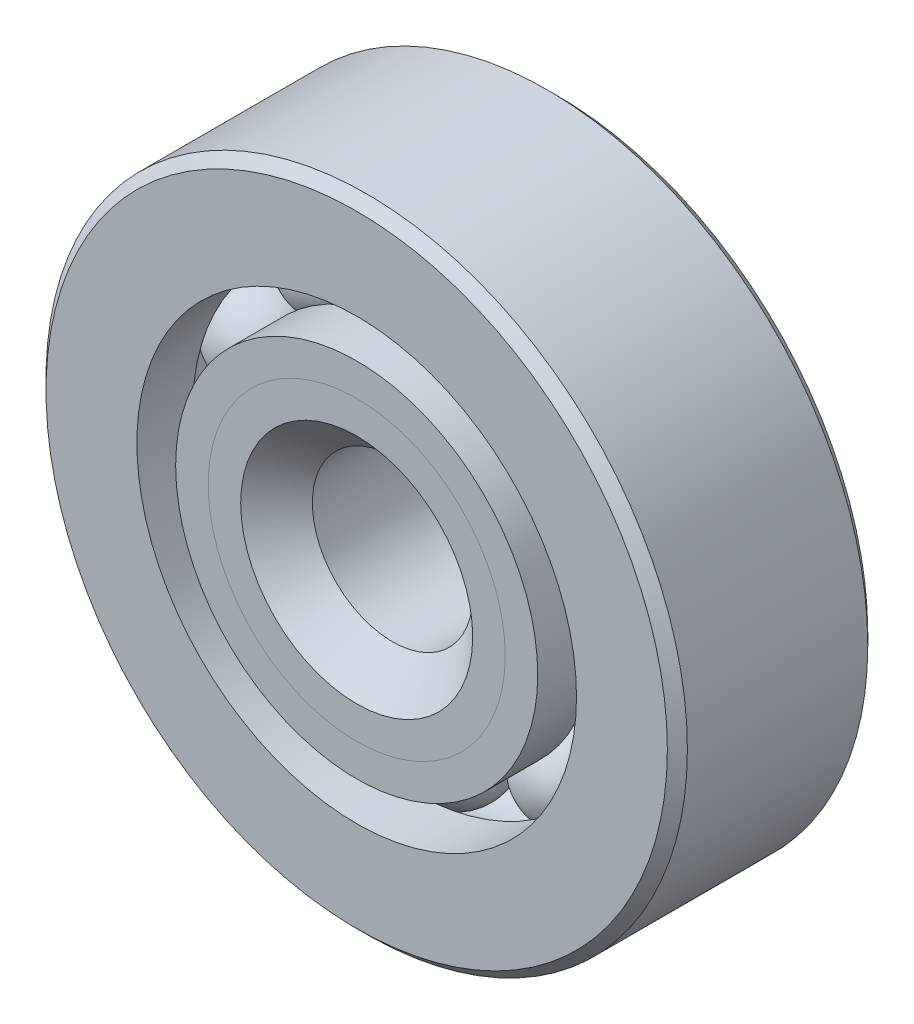
ISO-10303-21;
HEADER;
FILE_DESCRIPTION(('STEP AP214'),'2;1');
FILE_NAME('part.step','',(''),(''),'','','');
FILE_SCHEMA(('AUTOMOTIVE_DESIGN { 1 0 10303 214 1 1 1 1 }'));
ENDSEC;
DATA;
#1=APPLICATION_CONTEXT('core data for automotive mechanical design processes');
#2=APPLICATION_PROTOCOL_DEFINITION('international standard','automotive_design',2000,#1);
#3=PRODUCT_CONTEXT('',#1,'mechanical');
#4=PRODUCT('Part','Part','',(#3));
#5=PRODUCT_RELATED_PRODUCT_CATEGORY('part','',(#4));
#6=PRODUCT_DEFINITION_FORMATION('','',#4);
#7=PRODUCT_DEFINITION_CONTEXT('part definition',#1,'design');
#8=PRODUCT_DEFINITION('design','',#6,#7);
#9=PRODUCT_DEFINITION_SHAPE('','',#8);
#10=(LENGTH_UNIT() NAMED_UNIT(*) SI_UNIT(.MILLI.,.METRE.));
#11=(NAMED_UNIT(*) PLANE_ANGLE_UNIT() SI_UNIT($,.RADIAN.));
#12=(NAMED_UNIT(*) SI_UNIT($,.STERADIAN.) SOLID_ANGLE_UNIT());
#13=UNCERTAINTY_MEASURE_WITH_UNIT(LENGTH_MEASURE(1.E-05),#10,'distance_accuracy_value','');
#14=(GEOMETRIC_REPRESENTATION_CONTEXT(3) GLOBAL_UNCERTAINTY_ASSIGNED_CONTEXT((#13)) GLOBAL_UNIT_ASSIGNED_CONTEXT((#10,
#11,#12)) REPRESENTATION_CONTEXT('',''));
#15=CARTESIAN_POINT('',(0.,0.,0.));
#16=DIRECTION('',(0.,0.,1.));
#17=DIRECTION('',(1.,0.,0.));
#18=AXIS2_PLACEMENT_3D('',#15,#16,#17);
#19=CARTESIAN_POINT('',(-2.33277272003571,3.2107861964256,0.));
#20=DIRECTION('',(0.,0.,1.));
#21=DIRECTION('',(-0.587785252292462,0.809016994374955,0.));
#22=AXIS2_PLACEMENT_3D('',#19,#20,#21);
#23=SPHERICAL_SURFACE('',#22,0.961832467237323);
#24=CARTESIAN_POINT('',(-2.33277272003571,3.2107861964256,0.961832467237321));
#25=VERTEX_POINT('',#24);
#26=VERTEX_LOOP('',#25);
#27=FACE_BOUND('',#26,.T.);
#28=ADVANCED_FACE('F37',(#27),#23,.T.);
#29=CLOSED_SHELL('',(#28));
#30=MANIFOLD_SOLID_BREP('B2',#29);
#31=CARTESIAN_POINT('',(-3.77450554904638,1.22641119642562,0.));
#32=DIRECTION('',(0.,0.,1.));
#33=DIRECTION('',(-0.95105651629515,0.309016994374958,0.));
#34=AXIS2_PLACEMENT_3D('',#31,#32,#33);
#35=SPHERICAL_SURFACE('',#34,0.961832467237323);
#36=CARTESIAN_POINT('',(-3.77450554904638,1.22641119642562,0.961832467237321));
#37=VERTEX_POINT('',#36);
#38=VERTEX_LOOP('',#37);
#39=FACE_BOUND('',#38,.T.);
#40=ADVANCED_FACE('F68',(#39),#35,.T.);
#41=CLOSED_SHELL('',(#40));
#42=MANIFOLD_SOLID_BREP('B6',#41);
#43=CARTESIAN_POINT('',(-3.7745055490464,-1.22641119642554,0.));
#44=DIRECTION('',(0.,0.,1.));
#45=DIRECTION('',(-0.951056516295157,-0.309016994374938,0.));
#46=AXIS2_PLACEMENT_3D('',#43,#44,#45);
#47=SPHERICAL_SURFACE('',#46,0.961832467237323);
#48=CARTESIAN_POINT('',(-3.7745055490464,-1.22641119642554,0.961832467237321));
#49=VERTEX_POINT('',#48);
#50=VERTEX_LOOP('',#49);
#51=FACE_BOUND('',#50,.T.);
#52=ADVANCED_FACE('F99',(#51),#47,.T.);
#53=CLOSED_SHELL('',(#52));
#54=MANIFOLD_SOLID_BREP('B33',#53);
#55=CARTESIAN_POINT('',(-2.33277272003578,-3.21078619642555,0.));
#56=DIRECTION('',(0.,0.,1.));
#57=DIRECTION('',(-0.58778525229248,-0.809016994374942,0.));
#58=AXIS2_PLACEMENT_3D('',#55,#56,#57);
#59=SPHERICAL_SURFACE('',#58,0.961832467237323);
#60=CARTESIAN_POINT('',(-2.33277272003578,-3.21078619642555,0.961832467237321));
#61=VERTEX_POINT('',#60);
#62=VERTEX_LOOP('',#61);
#63=FACE_BOUND('',#62,.T.);
#64=ADVANCED_FACE('F130',(#63),#59,.T.);
#65=CLOSED_SHELL('',(#64));
#66=MANIFOLD_SOLID_BREP('B64',#65);
#67=CARTESIAN_POINT('',(0.,-3.96875,0.));
#68=DIRECTION('',(0.,0.,1.));
#69=DIRECTION('',(0.,-1.,0.));
#70=AXIS2_PLACEMENT_3D('',#67,#68,#69);
#71=SPHERICAL_SURFACE('',#70,0.961832467237323);
#72=CARTESIAN_POINT('',(0.,-3.96875,0.961832467237321));
#73=VERTEX_POINT('',#72);
#74=VERTEX_LOOP('',#73);
#75=FACE_BOUND('',#74,.T.);
#76=ADVANCED_FACE('F161',(#75),#71,.T.);
#77=CLOSED_SHELL('',(#76));
#78=MANIFOLD_SOLID_BREP('B95',#77);
#79=CARTESIAN_POINT('',(2.33277272003573,-3.21078619642559,0.));
#80=DIRECTION('',(0.,0.,1.));
#81=DIRECTION('',(0.587785252292469,-0.809016994374951,0.));
#82=AXIS2_PLACEMENT_3D('',#79,#80,#81);
#83=SPHERICAL_SURFACE('',#82,0.961832467237323);
#84=CARTESIAN_POINT('',(2.33277272003573,-3.21078619642559,0.961832467237321));
#85=VERTEX_POINT('',#84);
#86=VERTEX_LOOP('',#85);
#87=FACE_BOUND('',#86,.T.);
#88=ADVANCED_FACE('F192',(#87),#83,.T.);
#89=CLOSED_SHELL('',(#88));
#90=MANIFOLD_SOLID_BREP('B126',#89);
#91=CARTESIAN_POINT('',(3.77450554904639,-1.22641119642559,0.));
#92=DIRECTION('',(0.,0.,1.));
#93=DIRECTION('',(0.951056516295152,-0.309016994374952,0.));
#94=AXIS2_PLACEMENT_3D('',#91,#92,#93);
#95=SPHERICAL_SURFACE('',#94,0.961832467237323);
#96=CARTESIAN_POINT('',(3.77450554904639,-1.22641119642559,0.961832467237321));
#97=VERTEX_POINT('',#96);
#98=VERTEX_LOOP('',#97);
#99=FACE_BOUND('',#98,.T.);
#100=ADVANCED_FACE('F223',(#99),#95,.T.);
#101=CLOSED_SHELL('',(#100));
#102=MANIFOLD_SOLID_BREP('B157',#101);
#103=CARTESIAN_POINT('',(3.7745055490464,1.22641119642556,0.));
#104=DIRECTION('',(0.,0.,1.));
#105=DIRECTION('',(0.951056516295155,0.309016994374945,0.));
#106=AXIS2_PLACEMENT_3D('',#103,#104,#105);
#107=SPHERICAL_SURFACE('',#106,0.961832467237323);
#108=CARTESIAN_POINT('',(3.7745055490464,1.22641119642556,0.961832467237321));
#109=VERTEX_POINT('',#108);
#110=VERTEX_LOOP('',#109);
#111=FACE_BOUND('',#110,.T.);
#112=ADVANCED_FACE('F254',(#111),#107,.T.);
#113=CLOSED_SHELL('',(#112));
#114=MANIFOLD_SOLID_BREP('B188',#113);
#115=CARTESIAN_POINT('',(2.33277272003576,3.21078619642557,0.));
#116=DIRECTION('',(0.,0.,1.));
#117=DIRECTION('',(0.587785252292474,0.809016994374947,0.));
#118=AXIS2_PLACEMENT_3D('',#115,#116,#117);
#119=SPHERICAL_SURFACE('',#118,0.961832467237323);
#120=CARTESIAN_POINT('',(2.33277272003576,3.21078619642557,0.961832467237321));
#121=VERTEX_POINT('',#120);
#122=VERTEX_LOOP('',#121);
#123=FACE_BOUND('',#122,.T.);
#124=ADVANCED_FACE('F285',(#123),#119,.T.);
#125=CLOSED_SHELL('',(#124));
#126=MANIFOLD_SOLID_BREP('B219',#125);
#127=CARTESIAN_POINT('',(0.,3.96875,0.));
#128=DIRECTION('',(0.,0.,1.));
#129=DIRECTION('',(0.,1.,0.));
#130=AXIS2_PLACEMENT_3D('',#127,#128,#129);
#131=SPHERICAL_SURFACE('',#130,0.961832467237323);
#132=CARTESIAN_POINT('',(0.,3.96875,0.961832467237321));
#133=VERTEX_POINT('',#132);
#134=VERTEX_LOOP('',#133);
#135=FACE_BOUND('',#134,.T.);
#136=ADVANCED_FACE('F318',(#135),#131,.T.);
#137=CLOSED_SHELL('',(#136));
#138=MANIFOLD_SOLID_BREP('B250',#137);
#139=CARTESIAN_POINT('',(0.,2.94108377879507,1.984375));
#140=DIRECTION('',(0.,0.,-1.));
#141=DIRECTION('',(-1.,0.,0.));
#142=AXIS2_PLACEMENT_3D('',#139,#140,#141);
#143=PLANE('',#142);
#144=CARTESIAN_POINT('',(0.,0.,1.984375));
#145=DIRECTION('',(0.,0.,1.));
#146=DIRECTION('',(1.,0.,0.));
#147=AXIS2_PLACEMENT_3D('',#144,#145,#146);
#148=CIRCLE('',#147,2.29720876638134);
#149=CARTESIAN_POINT('',(2.29720876638134,0.,1.984375));
#150=VERTEX_POINT('',#149);
#151=EDGE_CURVE('E372',#150,#150,#148,.T.);
#152=ORIENTED_EDGE('',*,*,#151,.F.);
#153=EDGE_LOOP('',(#152));
#154=FACE_BOUND('',#153,.T.);
#155=CARTESIAN_POINT('',(0.,0.,1.984375));
#156=DIRECTION('',(0.,0.,1.));
#157=DIRECTION('',(1.,0.,0.));
#158=AXIS2_PLACEMENT_3D('',#155,#156,#157);
#159=CIRCLE('',#158,2.94108377879507);
#160=CARTESIAN_POINT('',(2.94108377879507,0.,1.984375));
#161=VERTEX_POINT('',#160);
#162=EDGE_CURVE('E317',#161,#161,#159,.T.);
#163=ORIENTED_EDGE('',*,*,#162,.T.);
#164=EDGE_LOOP('',(#163));
#165=FACE_BOUND('',#164,.T.);
#166=ADVANCED_FACE('F338',(#154,#165),#143,.F.);
#167=CARTESIAN_POINT('',(0.,0.,1.34049998758628));
#168=DIRECTION('',(0.,0.,1.));
#169=DIRECTION('',(1.,0.,0.));
#170=AXIS2_PLACEMENT_3D('',#167,#168,#169);
#171=CONICAL_SURFACE('',#170,2.29720876638134,0.78539816339745);
#172=ORIENTED_EDGE('',*,*,#162,.F.);
#173=EDGE_LOOP('',(#172));
#174=FACE_BOUND('',#173,.T.);
#175=CARTESIAN_POINT('',(0.,0.,1.34049998758628));
#176=DIRECTION('',(0.,0.,1.));
#177=DIRECTION('',(1.,0.,0.));
#178=AXIS2_PLACEMENT_3D('',#175,#176,#177);
#179=CIRCLE('',#178,2.29720876638134);
#180=CARTESIAN_POINT('',(2.29720876638134,0.,1.34049998758628));
#181=VERTEX_POINT('',#180);
#182=EDGE_CURVE('E344',#181,#181,#179,.T.);
#183=ORIENTED_EDGE('',*,*,#182,.T.);
#184=EDGE_LOOP('',(#183));
#185=FACE_BOUND('',#184,.T.);
#186=ADVANCED_FACE('F379',(#174,#185),#171,.T.);
#187=CARTESIAN_POINT('',(0.,0.,1.984375));
#188=DIRECTION('',(0.,0.,1.));
#189=DIRECTION('',(1.,0.,0.));
#190=AXIS2_PLACEMENT_3D('',#187,#188,#189);
#191=CYLINDRICAL_SURFACE('',#190,2.29720876638134);
#192=ORIENTED_EDGE('',*,*,#182,.F.);
#193=EDGE_LOOP('',(#192));
#194=FACE_BOUND('',#193,.T.);
#195=CARTESIAN_POINT('',(0.,0.,0.));
#196=DIRECTION('',(0.,0.,1.));
#197=DIRECTION('',(1.,0.,0.));
#198=AXIS2_PLACEMENT_3D('',#195,#196,#197);
#199=CIRCLE('',#198,2.29720876638134);
#200=CARTESIAN_POINT('',(2.29720876638134,0.,0.));
#201=VERTEX_POINT('',#200);
#202=EDGE_CURVE('E348',#201,#201,#199,.T.);
#203=ORIENTED_EDGE('',*,*,#202,.T.);
#204=EDGE_LOOP('',(#203));
#205=FACE_BOUND('',#204,.T.);
#206=ADVANCED_FACE('F383',(#194,#205),#191,.T.);
#207=CARTESIAN_POINT('',(0.,2.29720876638134,0.));
#208=DIRECTION('',(0.,0.,-1.));
#209=DIRECTION('',(-1.,0.,0.));
#210=AXIS2_PLACEMENT_3D('',#207,#208,#209);
#211=PLANE('',#210);
#212=ORIENTED_EDGE('',*,*,#202,.F.);
#213=EDGE_LOOP('',(#212));
#214=FACE_BOUND('',#213,.T.);
#215=CARTESIAN_POINT('',(0.,0.,0.));
#216=DIRECTION('',(0.,0.,1.));
#217=DIRECTION('',(1.,0.,0.));
#218=AXIS2_PLACEMENT_3D('',#215,#216,#217);
#219=CIRCLE('',#218,3.00691753276268);
#220=CARTESIAN_POINT('',(3.00691753276268,0.,0.));
#221=VERTEX_POINT('',#220);
#222=EDGE_CURVE('E352',#221,#221,#219,.T.);
#223=ORIENTED_EDGE('',*,*,#222,.T.);
#224=EDGE_LOOP('',(#223));
#225=FACE_BOUND('',#224,.T.);
#226=ADVANCED_FACE('F388',(#214,#225),#211,.F.);
#227=CARTESIAN_POINT('',(0.,0.,0.));
#228=DIRECTION('',(0.,0.,1.));
#229=DIRECTION('',(1.,0.,0.));
#230=AXIS2_PLACEMENT_3D('',#227,#228,#229);
#231=TOROIDAL_SURFACE('',#230,3.96875,0.961832467237321);
#232=ORIENTED_EDGE('',*,*,#222,.F.);
#233=EDGE_LOOP('',(#232));
#234=FACE_BOUND('',#233,.T.);
#235=CARTESIAN_POINT('',(0.,0.,-0.881944444444444));
#236=DIRECTION('',(0.,0.,1.));
#237=DIRECTION('',(1.,0.,0.));
#238=AXIS2_PLACEMENT_3D('',#235,#236,#237);
#239=CIRCLE('',#238,3.58495879120879);
#240=CARTESIAN_POINT('',(3.58495879120879,0.,-0.881944444444444));
#241=VERTEX_POINT('',#240);
#242=EDGE_CURVE('E357',#241,#241,#239,.T.);
#243=ORIENTED_EDGE('',*,*,#242,.T.);
#244=EDGE_LOOP('',(#243));
#245=FACE_BOUND('',#244,.T.);
#246=ADVANCED_FACE('F394',(#234,#245),#231,.F.);
#247=CARTESIAN_POINT('',(0.,0.,1.984375));
#248=DIRECTION('',(0.,0.,1.));
#249=DIRECTION('',(1.,0.,0.));
#250=AXIS2_PLACEMENT_3D('',#247,#248,#249);
#251=CYLINDRICAL_SURFACE('',#250,3.58495879120879);
#252=ORIENTED_EDGE('',*,*,#242,.F.);
#253=EDGE_LOOP('',(#252));
#254=FACE_BOUND('',#253,.T.);
#255=CARTESIAN_POINT('',(0.,0.,-1.984375));
#256=DIRECTION('',(0.,0.,1.));
#257=DIRECTION('',(1.,0.,0.));
#258=AXIS2_PLACEMENT_3D('',#255,#256,#257);
#259=CIRCLE('',#258,3.58495879120879);
#260=CARTESIAN_POINT('',(3.58495879120879,0.,-1.984375));
#261=VERTEX_POINT('',#260);
#262=EDGE_CURVE('E360',#261,#261,#259,.T.);
#263=ORIENTED_EDGE('',*,*,#262,.T.);
#264=EDGE_LOOP('',(#263));
#265=FACE_BOUND('',#264,.T.);
#266=ADVANCED_FACE('F398',(#254,#265),#251,.T.);
#267=CARTESIAN_POINT('',(0.,1.7859375,-1.984375));
#268=DIRECTION('',(0.,0.,1.));
#269=DIRECTION('',(1.,0.,0.));
#270=AXIS2_PLACEMENT_3D('',#267,#268,#269);
#271=PLANE('',#270);
#272=ORIENTED_EDGE('',*,*,#262,.F.);
#273=EDGE_LOOP('',(#272));
#274=FACE_BOUND('',#273,.T.);
#275=CARTESIAN_POINT('',(0.,0.,-1.984375));
#276=DIRECTION('',(0.,0.,1.));
#277=DIRECTION('',(1.,0.,0.));
#278=AXIS2_PLACEMENT_3D('',#275,#276,#277);
#279=CIRCLE('',#278,1.7859375);
#280=CARTESIAN_POINT('',(1.7859375,0.,-1.984375));
#281=VERTEX_POINT('',#280);
#282=EDGE_CURVE('E363',#281,#281,#279,.T.);
#283=ORIENTED_EDGE('',*,*,#282,.T.);
#284=EDGE_LOOP('',(#283));
#285=FACE_BOUND('',#284,.T.);
#286=ADVANCED_FACE('F402',(#274,#285),#271,.F.);
#287=CARTESIAN_POINT('',(0.,0.,-1.7859375));
#288=DIRECTION('',(0.,0.,-1.));
#289=DIRECTION('',(-1.,0.,0.));
#290=AXIS2_PLACEMENT_3D('',#287,#288,#289);
#291=CONICAL_SURFACE('',#290,1.5875,0.785398163397446);
#292=ORIENTED_EDGE('',*,*,#282,.F.);
#293=EDGE_LOOP('',(#292));
#294=FACE_BOUND('',#293,.T.);
#295=CARTESIAN_POINT('',(0.,0.,-1.7859375));
#296=DIRECTION('',(0.,0.,1.));
#297=DIRECTION('',(1.,0.,0.));
#298=AXIS2_PLACEMENT_3D('',#295,#296,#297);
#299=CIRCLE('',#298,1.5875);
#300=CARTESIAN_POINT('',(1.5875,0.,-1.7859375));
#301=VERTEX_POINT('',#300);
#302=EDGE_CURVE('E366',#301,#301,#299,.T.);
#303=ORIENTED_EDGE('',*,*,#302,.T.);
#304=EDGE_LOOP('',(#303));
#305=FACE_BOUND('',#304,.T.);
#306=ADVANCED_FACE('F406',(#294,#305),#291,.F.);
#307=CARTESIAN_POINT('',(0.,0.,1.984375));
#308=DIRECTION('',(0.,0.,1.));
#309=DIRECTION('',(1.,0.,0.));
#310=AXIS2_PLACEMENT_3D('',#307,#308,#309);
#311=CYLINDRICAL_SURFACE('',#310,1.5875);
#312=ORIENTED_EDGE('',*,*,#302,.F.);
#313=EDGE_LOOP('',(#312));
#314=FACE_BOUND('',#313,.T.);
#315=CARTESIAN_POINT('',(0.,0.,1.27466623361866));
#316=DIRECTION('',(0.,0.,1.));
#317=DIRECTION('',(1.,0.,0.));
#318=AXIS2_PLACEMENT_3D('',#315,#316,#317);
#319=CIRCLE('',#318,1.5875);
#320=CARTESIAN_POINT('',(1.5875,0.,1.27466623361866));
#321=VERTEX_POINT('',#320);
#322=EDGE_CURVE('E369',#321,#321,#319,.T.);
#323=ORIENTED_EDGE('',*,*,#322,.T.);
#324=EDGE_LOOP('',(#323));
#325=FACE_BOUND('',#324,.T.);
#326=ADVANCED_FACE('F410',(#314,#325),#311,.F.);
#327=CARTESIAN_POINT('',(0.,0.,1.984375));
#328=DIRECTION('',(0.,0.,1.));
#329=DIRECTION('',(1.,0.,0.));
#330=AXIS2_PLACEMENT_3D('',#327,#328,#329);
#331=CONICAL_SURFACE('',#330,2.29720876638134,0.785398163397448);
#332=ORIENTED_EDGE('',*,*,#322,.F.);
#333=EDGE_LOOP('',(#332));
#334=FACE_BOUND('',#333,.T.);
#335=ORIENTED_EDGE('',*,*,#151,.T.);
#336=EDGE_LOOP('',(#335));
#337=FACE_BOUND('',#336,.T.);
#338=ADVANCED_FACE('F376',(#334,#337),#331,.F.);
#339=CLOSED_SHELL('',(#166,#186,#206,#226,#246,#266,#286,#306,#326,#338));
#340=MANIFOLD_SOLID_BREP('B281',#339);
#341=CARTESIAN_POINT('',(0.,3.58495879120879,1.984375));
#342=DIRECTION('',(0.,0.,-1.));
#343=DIRECTION('',(-1.,0.,0.));
#344=AXIS2_PLACEMENT_3D('',#341,#342,#343);
#345=PLANE('',#344);
#346=CARTESIAN_POINT('',(0.,0.,1.984375));
#347=DIRECTION('',(0.,0.,1.));
#348=DIRECTION('',(1.,0.,0.));
#349=AXIS2_PLACEMENT_3D('',#346,#347,#348);
#350=CIRCLE('',#349,2.94108377879507);
#351=CARTESIAN_POINT('',(2.94108377879507,0.,1.984375));
#352=VERTEX_POINT('',#351);
#353=EDGE_CURVE('E337',#352,#352,#350,.T.);
#354=ORIENTED_EDGE('',*,*,#353,.F.);
#355=EDGE_LOOP('',(#354));
#356=FACE_BOUND('',#355,.T.);
#357=CARTESIAN_POINT('',(0.,0.,1.984375));
#358=DIRECTION('',(0.,0.,1.));
#359=DIRECTION('',(1.,0.,0.));
#360=AXIS2_PLACEMENT_3D('',#357,#358,#359);
#361=CIRCLE('',#360,3.58495879120879);
#362=CARTESIAN_POINT('',(3.58495879120879,0.,1.984375));
#363=VERTEX_POINT('',#362);
#364=EDGE_CURVE('E518',#363,#363,#361,.T.);
#365=ORIENTED_EDGE('',*,*,#364,.T.);
#366=EDGE_LOOP('',(#365));
#367=FACE_BOUND('',#366,.T.);
#368=ADVANCED_FACE('F496',(#356,#367),#345,.F.);
#369=CARTESIAN_POINT('',(0.,0.,1.984375));
#370=DIRECTION('',(0.,0.,1.));
#371=DIRECTION('',(1.,0.,0.));
#372=AXIS2_PLACEMENT_3D('',#369,#370,#371);
#373=CONICAL_SURFACE('',#372,2.94108377879507,0.78539816339745);
#374=CARTESIAN_POINT('',(0.,0.,1.34049998758628));
#375=DIRECTION('',(0.,0.,1.));
#376=DIRECTION('',(1.,0.,0.));
#377=AXIS2_PLACEMENT_3D('',#374,#375,#376);
#378=CIRCLE('',#377,2.29720876638134);
#379=CARTESIAN_POINT('',(2.29720876638134,0.,1.34049998758628));
#380=VERTEX_POINT('',#379);
#381=EDGE_CURVE('E502',#380,#380,#378,.T.);
#382=ORIENTED_EDGE('',*,*,#381,.F.);
#383=EDGE_LOOP('',(#382));
#384=FACE_BOUND('',#383,.T.);
#385=ORIENTED_EDGE('',*,*,#353,.T.);
#386=EDGE_LOOP('',(#385));
#387=FACE_BOUND('',#386,.T.);
#388=ADVANCED_FACE('F543',(#384,#387),#373,.F.);
#389=CARTESIAN_POINT('',(0.,0.,1.984375));
#390=DIRECTION('',(0.,0.,1.));
#391=DIRECTION('',(1.,0.,0.));
#392=AXIS2_PLACEMENT_3D('',#389,#390,#391);
#393=CYLINDRICAL_SURFACE('',#392,2.29720876638134);
#394=CARTESIAN_POINT('',(0.,0.,0.));
#395=DIRECTION('',(0.,0.,1.));
#396=DIRECTION('',(1.,0.,0.));
#397=AXIS2_PLACEMENT_3D('',#394,#395,#396);
#398=CIRCLE('',#397,2.29720876638134);
#399=CARTESIAN_POINT('',(2.29720876638134,0.,0.));
#400=VERTEX_POINT('',#399);
#401=EDGE_CURVE('E506',#400,#400,#398,.T.);
#402=ORIENTED_EDGE('',*,*,#401,.F.);
#403=EDGE_LOOP('',(#402));
#404=FACE_BOUND('',#403,.T.);
#405=ORIENTED_EDGE('',*,*,#381,.T.);
#406=EDGE_LOOP('',(#405));
#407=FACE_BOUND('',#406,.T.);
#408=ADVANCED_FACE('F538',(#404,#407),#393,.F.);
#409=CARTESIAN_POINT('',(0.,2.29720876638134,0.));
#410=DIRECTION('',(0.,0.,1.));
#411=DIRECTION('',(1.,0.,0.));
#412=AXIS2_PLACEMENT_3D('',#409,#410,#411);
#413=PLANE('',#412);
#414=CARTESIAN_POINT('',(0.,0.,0.));
#415=DIRECTION('',(0.,0.,1.));
#416=DIRECTION('',(1.,0.,0.));
#417=AXIS2_PLACEMENT_3D('',#414,#415,#416);
#418=CIRCLE('',#417,3.00691753276268);
#419=CARTESIAN_POINT('',(3.00691753276268,0.,0.));
#420=VERTEX_POINT('',#419);
#421=EDGE_CURVE('E510',#420,#420,#418,.T.);
#422=ORIENTED_EDGE('',*,*,#421,.F.);
#423=EDGE_LOOP('',(#422));
#424=FACE_BOUND('',#423,.T.);
#425=ORIENTED_EDGE('',*,*,#401,.T.);
#426=EDGE_LOOP('',(#425));
#427=FACE_BOUND('',#426,.T.);
#428=ADVANCED_FACE('F532',(#424,#427),#413,.F.);
#429=CARTESIAN_POINT('',(0.,0.,0.));
#430=DIRECTION('',(0.,0.,1.));
#431=DIRECTION('',(1.,0.,0.));
#432=AXIS2_PLACEMENT_3D('',#429,#430,#431);
#433=TOROIDAL_SURFACE('',#432,3.96875,0.961832467237323);
#434=CARTESIAN_POINT('',(0.,0.,0.881944444444442));
#435=DIRECTION('',(0.,0.,1.));
#436=DIRECTION('',(1.,0.,0.));
#437=AXIS2_PLACEMENT_3D('',#434,#435,#436);
#438=CIRCLE('',#437,3.58495879120879);
#439=CARTESIAN_POINT('',(3.58495879120879,0.,0.881944444444442));
#440=VERTEX_POINT('',#439);
#441=EDGE_CURVE('E515',#440,#440,#438,.T.);
#442=ORIENTED_EDGE('',*,*,#441,.F.);
#443=EDGE_LOOP('',(#442));
#444=FACE_BOUND('',#443,.T.);
#445=ORIENTED_EDGE('',*,*,#421,.T.);
#446=EDGE_LOOP('',(#445));
#447=FACE_BOUND('',#446,.T.);
#448=ADVANCED_FACE('F526',(#444,#447),#433,.F.);
#449=CARTESIAN_POINT('',(0.,0.,1.984375));
#450=DIRECTION('',(0.,0.,1.));
#451=DIRECTION('',(1.,0.,0.));
#452=AXIS2_PLACEMENT_3D('',#449,#450,#451);
#453=CYLINDRICAL_SURFACE('',#452,3.58495879120879);
#454=ORIENTED_EDGE('',*,*,#364,.F.);
#455=EDGE_LOOP('',(#454));
#456=FACE_BOUND('',#455,.T.);
#457=ORIENTED_EDGE('',*,*,#441,.T.);
#458=EDGE_LOOP('',(#457));
#459=FACE_BOUND('',#458,.T.);
#460=ADVANCED_FACE('F523',(#456,#459),#453,.T.);
#461=CLOSED_SHELL('',(#368,#388,#408,#428,#448,#460));
#462=MANIFOLD_SOLID_BREP('B312',#461);
#463=CARTESIAN_POINT('',(0.,0.,1.7859375));
#464=DIRECTION('',(0.,0.,-1.));
#465=DIRECTION('',(-1.,0.,0.));
#466=AXIS2_PLACEMENT_3D('',#463,#464,#465);
#467=CONICAL_SURFACE('',#466,6.35,0.785398163397446);
#468=CARTESIAN_POINT('',(0.,0.,1.984375));
#469=DIRECTION('',(0.,0.,1.));
#470=DIRECTION('',(1.,0.,0.));
#471=AXIS2_PLACEMENT_3D('',#468,#469,#470);
#472=CIRCLE('',#471,6.1515625);
#473=CARTESIAN_POINT('',(6.1515625,0.,1.984375));
#474=VERTEX_POINT('',#473);
#475=EDGE_CURVE('E615',#474,#474,#472,.T.);
#476=ORIENTED_EDGE('',*,*,#475,.F.);
#477=EDGE_LOOP('',(#476));
#478=FACE_BOUND('',#477,.T.);
#479=CARTESIAN_POINT('',(0.,0.,1.7859375));
#480=DIRECTION('',(0.,0.,1.));
#481=DIRECTION('',(1.,0.,0.));
#482=AXIS2_PLACEMENT_3D('',#479,#480,#481);
#483=CIRCLE('',#482,6.35);
#484=CARTESIAN_POINT('',(6.35,0.,1.7859375));
#485=VERTEX_POINT('',#484);
#486=EDGE_CURVE('E495',#485,#485,#483,.T.);
#487=ORIENTED_EDGE('',*,*,#486,.T.);
#488=EDGE_LOOP('',(#487));
#489=FACE_BOUND('',#488,.T.);
#490=ADVANCED_FACE('F587',(#478,#489),#467,.T.);
#491=CARTESIAN_POINT('',(0.,0.,1.984375));
#492=DIRECTION('',(0.,0.,1.));
#493=DIRECTION('',(1.,0.,0.));
#494=AXIS2_PLACEMENT_3D('',#491,#492,#493);
#495=CYLINDRICAL_SURFACE('',#494,6.35);
#496=ORIENTED_EDGE('',*,*,#486,.F.);
#497=EDGE_LOOP('',(#496));
#498=FACE_BOUND('',#497,.T.);
#499=CARTESIAN_POINT('',(0.,0.,-1.7859375));
#500=DIRECTION('',(0.,0.,1.));
#501=DIRECTION('',(1.,0.,0.));
#502=AXIS2_PLACEMENT_3D('',#499,#500,#501);
#503=CIRCLE('',#502,6.35);
#504=CARTESIAN_POINT('',(6.35,0.,-1.7859375));
#505=VERTEX_POINT('',#504);
#506=EDGE_CURVE('E593',#505,#505,#503,.T.);
#507=ORIENTED_EDGE('',*,*,#506,.T.);
#508=EDGE_LOOP('',(#507));
#509=FACE_BOUND('',#508,.T.);
#510=ADVANCED_FACE('F622',(#498,#509),#495,.T.);
#511=CARTESIAN_POINT('',(0.,0.,-1.984375));
#512=DIRECTION('',(0.,0.,1.));
#513=DIRECTION('',(1.,0.,0.));
#514=AXIS2_PLACEMENT_3D('',#511,#512,#513);
#515=CONICAL_SURFACE('',#514,6.1515625,0.785398163397446);
#516=ORIENTED_EDGE('',*,*,#506,.F.);
#517=EDGE_LOOP('',(#516));
#518=FACE_BOUND('',#517,.T.);
#519=CARTESIAN_POINT('',(0.,0.,-1.984375));
#520=DIRECTION('',(0.,0.,1.));
#521=DIRECTION('',(1.,0.,0.));
#522=AXIS2_PLACEMENT_3D('',#519,#520,#521);
#523=CIRCLE('',#522,6.1515625);
#524=CARTESIAN_POINT('',(6.1515625,0.,-1.984375));
#525=VERTEX_POINT('',#524);
#526=EDGE_CURVE('E597',#525,#525,#523,.T.);
#527=ORIENTED_EDGE('',*,*,#526,.T.);
#528=EDGE_LOOP('',(#527));
#529=FACE_BOUND('',#528,.T.);
#530=ADVANCED_FACE('F626',(#518,#529),#515,.T.);
#531=CARTESIAN_POINT('',(0.,6.1515625,-1.984375));
#532=DIRECTION('',(0.,0.,1.));
#533=DIRECTION('',(1.,0.,0.));
#534=AXIS2_PLACEMENT_3D('',#531,#532,#533);
#535=PLANE('',#534);
#536=ORIENTED_EDGE('',*,*,#526,.F.);
#537=EDGE_LOOP('',(#536));
#538=FACE_BOUND('',#537,.T.);
#539=CARTESIAN_POINT('',(0.,0.,-1.98437500000001));
#540=DIRECTION('',(0.,0.,1.));
#541=DIRECTION('',(1.,0.,0.));
#542=AXIS2_PLACEMENT_3D('',#539,#540,#541);
#543=CIRCLE('',#542,4.35254120879121);
#544=CARTESIAN_POINT('',(4.35254120879121,0.,-1.98437500000001));
#545=VERTEX_POINT('',#544);
#546=EDGE_CURVE('E601',#545,#545,#543,.T.);
#547=ORIENTED_EDGE('',*,*,#546,.T.);
#548=EDGE_LOOP('',(#547));
#549=FACE_BOUND('',#548,.T.);
#550=ADVANCED_FACE('F631',(#538,#549),#535,.F.);
#551=CARTESIAN_POINT('',(0.,0.,1.984375));
#552=DIRECTION('',(0.,0.,1.));
#553=DIRECTION('',(1.,0.,0.));
#554=AXIS2_PLACEMENT_3D('',#551,#552,#553);
#555=CYLINDRICAL_SURFACE('',#554,4.35254120879121);
#556=ORIENTED_EDGE('',*,*,#546,.F.);
#557=EDGE_LOOP('',(#556));
#558=FACE_BOUND('',#557,.T.);
#559=CARTESIAN_POINT('',(0.,0.,-0.881944444444447));
#560=DIRECTION('',(0.,0.,1.));
#561=DIRECTION('',(1.,0.,0.));
#562=AXIS2_PLACEMENT_3D('',#559,#560,#561);
#563=CIRCLE('',#562,4.35254120879121);
#564=CARTESIAN_POINT('',(4.35254120879121,0.,-0.881944444444447));
#565=VERTEX_POINT('',#564);
#566=EDGE_CURVE('E606',#565,#565,#563,.T.);
#567=ORIENTED_EDGE('',*,*,#566,.T.);
#568=EDGE_LOOP('',(#567));
#569=FACE_BOUND('',#568,.T.);
#570=ADVANCED_FACE('F637',(#558,#569),#555,.F.);
#571=CARTESIAN_POINT('',(0.,0.,0.));
#572=DIRECTION('',(0.,0.,1.));
#573=DIRECTION('',(1.,0.,0.));
#574=AXIS2_PLACEMENT_3D('',#571,#572,#573);
#575=TOROIDAL_SURFACE('',#574,3.96875,0.961832467237323);
#576=ORIENTED_EDGE('',*,*,#566,.F.);
#577=EDGE_LOOP('',(#576));
#578=FACE_BOUND('',#577,.T.);
#579=CARTESIAN_POINT('',(0.,0.,0.881944444444442));
#580=DIRECTION('',(0.,0.,1.));
#581=DIRECTION('',(1.,0.,0.));
#582=AXIS2_PLACEMENT_3D('',#579,#580,#581);
#583=CIRCLE('',#582,4.35254120879121);
#584=CARTESIAN_POINT('',(4.35254120879121,0.,0.881944444444442));
#585=VERTEX_POINT('',#584);
#586=EDGE_CURVE('E609',#585,#585,#583,.T.);
#587=ORIENTED_EDGE('',*,*,#586,.T.);
#588=EDGE_LOOP('',(#587));
#589=FACE_BOUND('',#588,.T.);
#590=ADVANCED_FACE('F641',(#578,#589),#575,.F.);
#591=CARTESIAN_POINT('',(0.,0.,1.984375));
#592=DIRECTION('',(0.,0.,1.));
#593=DIRECTION('',(1.,0.,0.));
#594=AXIS2_PLACEMENT_3D('',#591,#592,#593);
#595=CYLINDRICAL_SURFACE('',#594,4.35254120879121);
#596=ORIENTED_EDGE('',*,*,#586,.F.);
#597=EDGE_LOOP('',(#596));
#598=FACE_BOUND('',#597,.T.);
#599=CARTESIAN_POINT('',(0.,0.,1.984375));
#600=DIRECTION('',(0.,0.,1.));
#601=DIRECTION('',(1.,0.,0.));
#602=AXIS2_PLACEMENT_3D('',#599,#600,#601);
#603=CIRCLE('',#602,4.35254120879121);
#604=CARTESIAN_POINT('',(4.35254120879121,0.,1.984375));
#605=VERTEX_POINT('',#604);
#606=EDGE_CURVE('E612',#605,#605,#603,.T.);
#607=ORIENTED_EDGE('',*,*,#606,.T.);
#608=EDGE_LOOP('',(#607));
#609=FACE_BOUND('',#608,.T.);
#610=ADVANCED_FACE('F645',(#598,#609),#595,.F.);
#611=CARTESIAN_POINT('',(0.,6.1515625,1.984375));
#612=DIRECTION('',(0.,0.,-1.));
#613=DIRECTION('',(-1.,0.,0.));
#614=AXIS2_PLACEMENT_3D('',#611,#612,#613);
#615=PLANE('',#614);
#616=ORIENTED_EDGE('',*,*,#606,.F.);
#617=EDGE_LOOP('',(#616));
#618=FACE_BOUND('',#617,.T.);
#619=ORIENTED_EDGE('',*,*,#475,.T.);
#620=EDGE_LOOP('',(#619));
#621=FACE_BOUND('',#620,.T.);
#622=ADVANCED_FACE('F619',(#618,#621),#615,.F.);
#623=CLOSED_SHELL('',(#490,#510,#530,#550,#570,#590,#610,#622));
#624=MANIFOLD_SOLID_BREP('B332',#623);
#625=ADVANCED_BREP_SHAPE_REPRESENTATION('',(#18,#30,#42,#54,#66,#78,#90,#102,#114,#126,#138,
#340,#462,#624),#14);
#626=SHAPE_DEFINITION_REPRESENTATION(#9,#625);
ENDSEC;
END-ISO-10303-21;
